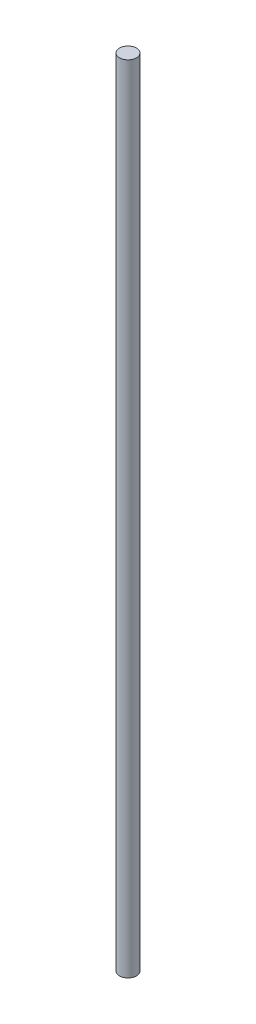
ISO-10303-21;
HEADER;
FILE_DESCRIPTION(('STEP AP214'),'2;1');
FILE_NAME('part.step','',(''),(''),'','','');
FILE_SCHEMA(('AUTOMOTIVE_DESIGN { 1 0 10303 214 1 1 1 1 }'));
ENDSEC;
DATA;
#1=APPLICATION_CONTEXT('core data for automotive mechanical design processes');
#2=APPLICATION_PROTOCOL_DEFINITION('international standard','automotive_design',2000,#1);
#3=PRODUCT_CONTEXT('',#1,'mechanical');
#4=PRODUCT('Part','Part','',(#3));
#5=PRODUCT_RELATED_PRODUCT_CATEGORY('part','',(#4));
#6=PRODUCT_DEFINITION_FORMATION('','',#4);
#7=PRODUCT_DEFINITION_CONTEXT('part definition',#1,'design');
#8=PRODUCT_DEFINITION('design','',#6,#7);
#9=PRODUCT_DEFINITION_SHAPE('','',#8);
#10=(LENGTH_UNIT() NAMED_UNIT(*) SI_UNIT(.MILLI.,.METRE.));
#11=(NAMED_UNIT(*) PLANE_ANGLE_UNIT() SI_UNIT($,.RADIAN.));
#12=(NAMED_UNIT(*) SI_UNIT($,.STERADIAN.) SOLID_ANGLE_UNIT());
#13=UNCERTAINTY_MEASURE_WITH_UNIT(LENGTH_MEASURE(1.E-05),#10,'distance_accuracy_value','');
#14=(GEOMETRIC_REPRESENTATION_CONTEXT(3) GLOBAL_UNCERTAINTY_ASSIGNED_CONTEXT((#13)) GLOBAL_UNIT_ASSIGNED_CONTEXT((#10,
#11,#12)) REPRESENTATION_CONTEXT('',''));
#15=CARTESIAN_POINT('',(0.,0.,0.));
#16=DIRECTION('',(0.,0.,1.));
#17=DIRECTION('',(1.,0.,0.));
#18=AXIS2_PLACEMENT_3D('',#15,#16,#17);
#19=CARTESIAN_POINT('',(0.,150.,0.));
#20=DIRECTION('',(0.,-1.,0.));
#21=DIRECTION('',(0.,0.,-1.));
#22=AXIS2_PLACEMENT_3D('',#19,#20,#21);
#23=CYLINDRICAL_SURFACE('',#22,1.6);
#24=CARTESIAN_POINT('',(0.,150.,0.));
#25=DIRECTION('',(0.,1.,0.));
#26=DIRECTION('',(0.,0.,1.));
#27=AXIS2_PLACEMENT_3D('',#24,#25,#26);
#28=CIRCLE('',#27,1.6);
#29=CARTESIAN_POINT('',(0.,150.,1.6));
#30=VERTEX_POINT('',#29);
#31=EDGE_CURVE('E10',#30,#30,#28,.T.);
#32=ORIENTED_EDGE('',*,*,#31,.F.);
#33=EDGE_LOOP('',(#32));
#34=FACE_BOUND('',#33,.T.);
#35=CARTESIAN_POINT('',(0.,0.,0.));
#36=DIRECTION('',(0.,1.,0.));
#37=DIRECTION('',(0.,0.,1.));
#38=AXIS2_PLACEMENT_3D('',#35,#36,#37);
#39=CIRCLE('',#38,1.6);
#40=CARTESIAN_POINT('',(0.,0.,1.6));
#41=VERTEX_POINT('',#40);
#42=EDGE_CURVE('E34',#41,#41,#39,.T.);
#43=ORIENTED_EDGE('',*,*,#42,.T.);
#44=EDGE_LOOP('',(#43));
#45=FACE_BOUND('',#44,.T.);
#46=ADVANCED_FACE('F31',(#34,#45),#23,.T.);
#47=CARTESIAN_POINT('',(0.,150.,0.));
#48=DIRECTION('',(0.,1.,0.));
#49=DIRECTION('',(0.,0.,1.));
#50=AXIS2_PLACEMENT_3D('',#47,#48,#49);
#51=PLANE('',#50);
#52=ORIENTED_EDGE('',*,*,#31,.T.);
#53=EDGE_LOOP('',(#52));
#54=FACE_BOUND('',#53,.T.);
#55=ADVANCED_FACE('F46',(#54),#51,.T.);
#56=CARTESIAN_POINT('',(0.,0.,0.));
#57=DIRECTION('',(0.,1.,0.));
#58=DIRECTION('',(0.,0.,1.));
#59=AXIS2_PLACEMENT_3D('',#56,#57,#58);
#60=PLANE('',#59);
#61=ORIENTED_EDGE('',*,*,#42,.F.);
#62=EDGE_LOOP('',(#61));
#63=FACE_BOUND('',#62,.T.);
#64=ADVANCED_FACE('F44',(#63),#60,.F.);
#65=CLOSED_SHELL('',(#46,#55,#64));
#66=MANIFOLD_SOLID_BREP('B2',#65);
#67=ADVANCED_BREP_SHAPE_REPRESENTATION('',(#18,#66),#14);
#68=SHAPE_DEFINITION_REPRESENTATION(#9,#67);
ENDSEC;
END-ISO-10303-21;
